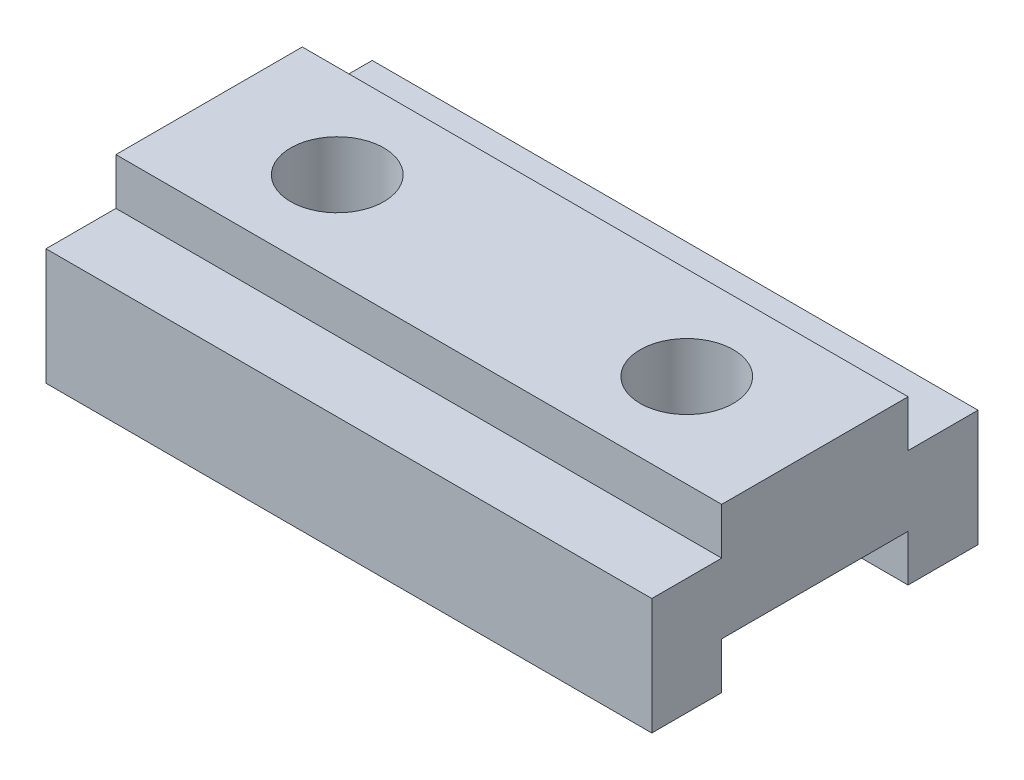
ISO-10303-21;
HEADER;
FILE_DESCRIPTION(('STEP AP214'),'2;1');
FILE_NAME('part.step','',(''),(''),'','','');
FILE_SCHEMA(('AUTOMOTIVE_DESIGN { 1 0 10303 214 1 1 1 1 }'));
ENDSEC;
DATA;
#1=APPLICATION_CONTEXT('core data for automotive mechanical design processes');
#2=APPLICATION_PROTOCOL_DEFINITION('international standard','automotive_design',2000,#1);
#3=PRODUCT_CONTEXT('',#1,'mechanical');
#4=PRODUCT('Part','Part','',(#3));
#5=PRODUCT_RELATED_PRODUCT_CATEGORY('part','',(#4));
#6=PRODUCT_DEFINITION_FORMATION('','',#4);
#7=PRODUCT_DEFINITION_CONTEXT('part definition',#1,'design');
#8=PRODUCT_DEFINITION('design','',#6,#7);
#9=PRODUCT_DEFINITION_SHAPE('','',#8);
#10=(LENGTH_UNIT() NAMED_UNIT(*) SI_UNIT(.MILLI.,.METRE.));
#11=(NAMED_UNIT(*) PLANE_ANGLE_UNIT() SI_UNIT($,.RADIAN.));
#12=(NAMED_UNIT(*) SI_UNIT($,.STERADIAN.) SOLID_ANGLE_UNIT());
#13=UNCERTAINTY_MEASURE_WITH_UNIT(LENGTH_MEASURE(1.E-05),#10,'distance_accuracy_value','');
#14=(GEOMETRIC_REPRESENTATION_CONTEXT(3) GLOBAL_UNCERTAINTY_ASSIGNED_CONTEXT((#13)) GLOBAL_UNIT_ASSIGNED_CONTEXT((#10,
#11,#12)) REPRESENTATION_CONTEXT('',''));
#15=CARTESIAN_POINT('',(0.,0.,0.));
#16=DIRECTION('',(0.,0.,1.));
#17=DIRECTION('',(1.,0.,0.));
#18=AXIS2_PLACEMENT_3D('',#15,#16,#17);
#19=CARTESIAN_POINT('',(-165.1,0.,0.));
#20=DIRECTION('',(0.,0.,1.));
#21=DIRECTION('',(1.,0.,0.));
#22=AXIS2_PLACEMENT_3D('',#19,#20,#21);
#23=PLANE('',#22);
#24=DIRECTION('',(0.,-1.,0.));
#25=VECTOR('',#24,1.);
#26=CARTESIAN_POINT('',(0.,0.,0.));
#27=LINE('',#26,#25);
#28=CARTESIAN_POINT('',(0.,31.75,0.));
#29=VERTEX_POINT('',#28);
#30=CARTESIAN_POINT('',(0.,0.,0.));
#31=VERTEX_POINT('',#30);
#32=EDGE_CURVE('E155',#29,#31,#27,.T.);
#33=ORIENTED_EDGE('',*,*,#32,.F.);
#34=DIRECTION('',(1.,0.,0.));
#35=VECTOR('',#34,1.);
#36=CARTESIAN_POINT('',(-165.1,31.75,0.));
#37=LINE('',#36,#35);
#38=CARTESIAN_POINT('',(-165.1,31.75,0.));
#39=VERTEX_POINT('',#38);
#40=EDGE_CURVE('E11',#39,#29,#37,.T.);
#41=ORIENTED_EDGE('',*,*,#40,.F.);
#42=DIRECTION('',(0.,-1.,0.));
#43=VECTOR('',#42,1.);
#44=CARTESIAN_POINT('',(-165.1,0.,0.));
#45=LINE('',#44,#43);
#46=CARTESIAN_POINT('',(-165.1,0.,0.));
#47=VERTEX_POINT('',#46);
#48=EDGE_CURVE('E187',#39,#47,#45,.T.);
#49=ORIENTED_EDGE('',*,*,#48,.T.);
#50=DIRECTION('',(1.,0.,0.));
#51=VECTOR('',#50,1.);
#52=CARTESIAN_POINT('',(-165.1,0.,0.));
#53=LINE('',#52,#51);
#54=EDGE_CURVE('E101',#47,#31,#53,.T.);
#55=ORIENTED_EDGE('',*,*,#54,.T.);
#56=EDGE_LOOP('',(#33,#41,#49,#55));
#57=FACE_BOUND('',#56,.T.);
#58=ADVANCED_FACE('F33',(#57),#23,.T.);
#59=CARTESIAN_POINT('',(-165.1,31.75,0.));
#60=DIRECTION('',(0.,1.,0.));
#61=DIRECTION('',(0.,0.,1.));
#62=AXIS2_PLACEMENT_3D('',#59,#60,#61);
#63=PLANE('',#62);
#64=DIRECTION('',(0.,0.,1.));
#65=VECTOR('',#64,1.);
#66=CARTESIAN_POINT('',(0.,31.75,0.));
#67=LINE('',#66,#65);
#68=CARTESIAN_POINT('',(0.,31.75,-19.05));
#69=VERTEX_POINT('',#68);
#70=EDGE_CURVE('E185',#69,#29,#67,.T.);
#71=ORIENTED_EDGE('',*,*,#70,.F.);
#72=DIRECTION('',(1.,0.,0.));
#73=VECTOR('',#72,1.);
#74=CARTESIAN_POINT('',(-165.1,31.75,-19.05));
#75=LINE('',#74,#73);
#76=CARTESIAN_POINT('',(-165.1,31.75,-19.05));
#77=VERTEX_POINT('',#76);
#78=EDGE_CURVE('E42',#77,#69,#75,.T.);
#79=ORIENTED_EDGE('',*,*,#78,.F.);
#80=DIRECTION('',(0.,0.,1.));
#81=VECTOR('',#80,1.);
#82=CARTESIAN_POINT('',(-165.1,31.75,0.));
#83=LINE('',#82,#81);
#84=EDGE_CURVE('E145',#77,#39,#83,.T.);
#85=ORIENTED_EDGE('',*,*,#84,.T.);
#86=ORIENTED_EDGE('',*,*,#40,.T.);
#87=EDGE_LOOP('',(#71,#79,#85,#86));
#88=FACE_BOUND('',#87,.T.);
#89=ADVANCED_FACE('F265',(#88),#63,.T.);
#90=CARTESIAN_POINT('',(-165.1,31.75,-19.05));
#91=DIRECTION('',(0.,0.,1.));
#92=DIRECTION('',(1.,0.,0.));
#93=AXIS2_PLACEMENT_3D('',#90,#91,#92);
#94=PLANE('',#93);
#95=DIRECTION('',(0.,-1.,0.));
#96=VECTOR('',#95,1.);
#97=CARTESIAN_POINT('',(0.,31.75,-19.05));
#98=LINE('',#97,#96);
#99=CARTESIAN_POINT('',(0.,44.45,-19.05));
#100=VERTEX_POINT('',#99);
#101=EDGE_CURVE('E132',#100,#69,#98,.T.);
#102=ORIENTED_EDGE('',*,*,#101,.F.);
#103=DIRECTION('',(1.,0.,0.));
#104=VECTOR('',#103,1.);
#105=CARTESIAN_POINT('',(-165.1,44.45,-19.05));
#106=LINE('',#105,#104);
#107=CARTESIAN_POINT('',(-165.1,44.45,-19.05));
#108=VERTEX_POINT('',#107);
#109=EDGE_CURVE('E127',#108,#100,#106,.T.);
#110=ORIENTED_EDGE('',*,*,#109,.F.);
#111=DIRECTION('',(0.,-1.,0.));
#112=VECTOR('',#111,1.);
#113=CARTESIAN_POINT('',(-165.1,31.75,-19.05));
#114=LINE('',#113,#112);
#115=EDGE_CURVE('E130',#108,#77,#114,.T.);
#116=ORIENTED_EDGE('',*,*,#115,.T.);
#117=ORIENTED_EDGE('',*,*,#78,.T.);
#118=EDGE_LOOP('',(#102,#110,#116,#117));
#119=FACE_BOUND('',#118,.T.);
#120=ADVANCED_FACE('F129',(#119),#94,.T.);
#121=CARTESIAN_POINT('',(-165.1,44.45,-19.05));
#122=DIRECTION('',(0.,1.,0.));
#123=DIRECTION('',(0.,0.,1.));
#124=AXIS2_PLACEMENT_3D('',#121,#122,#123);
#125=PLANE('',#124);
#126=CARTESIAN_POINT('',(-130.175,44.45,-44.45));
#127=DIRECTION('',(0.,1.,0.));
#128=DIRECTION('',(0.,0.,1.));
#129=AXIS2_PLACEMENT_3D('',#126,#127,#128);
#130=CIRCLE('',#129,12.7);
#131=CARTESIAN_POINT('',(-130.175,44.45,-31.75));
#132=VERTEX_POINT('',#131);
#133=EDGE_CURVE('E207',#132,#132,#130,.T.);
#134=ORIENTED_EDGE('',*,*,#133,.F.);
#135=EDGE_LOOP('',(#134));
#136=FACE_BOUND('',#135,.T.);
#137=CARTESIAN_POINT('',(-34.925,44.45,-44.45));
#138=DIRECTION('',(0.,1.,0.));
#139=DIRECTION('',(0.,0.,1.));
#140=AXIS2_PLACEMENT_3D('',#137,#138,#139);
#141=CIRCLE('',#140,12.7);
#142=CARTESIAN_POINT('',(-34.925,44.45,-31.75));
#143=VERTEX_POINT('',#142);
#144=EDGE_CURVE('E212',#143,#143,#141,.T.);
#145=ORIENTED_EDGE('',*,*,#144,.F.);
#146=EDGE_LOOP('',(#145));
#147=FACE_BOUND('',#146,.T.);
#148=DIRECTION('',(0.,0.,1.));
#149=VECTOR('',#148,1.);
#150=CARTESIAN_POINT('',(0.,44.45,-19.05));
#151=LINE('',#150,#149);
#152=CARTESIAN_POINT('',(0.,44.45,-69.85));
#153=VERTEX_POINT('',#152);
#154=EDGE_CURVE('E182',#153,#100,#151,.T.);
#155=ORIENTED_EDGE('',*,*,#154,.F.);
#156=DIRECTION('',(1.,0.,0.));
#157=VECTOR('',#156,1.);
#158=CARTESIAN_POINT('',(-165.1,44.45,-69.85));
#159=LINE('',#158,#157);
#160=CARTESIAN_POINT('',(-165.1,44.45,-69.85));
#161=VERTEX_POINT('',#160);
#162=EDGE_CURVE('E137',#161,#153,#159,.T.);
#163=ORIENTED_EDGE('',*,*,#162,.F.);
#164=DIRECTION('',(0.,0.,1.));
#165=VECTOR('',#164,1.);
#166=CARTESIAN_POINT('',(-165.1,44.45,-19.05));
#167=LINE('',#166,#165);
#168=EDGE_CURVE('E143',#161,#108,#167,.T.);
#169=ORIENTED_EDGE('',*,*,#168,.T.);
#170=ORIENTED_EDGE('',*,*,#109,.T.);
#171=EDGE_LOOP('',(#155,#163,#169,#170));
#172=FACE_BOUND('',#171,.T.);
#173=ADVANCED_FACE('F147',(#136,#147,#172),#125,.T.);
#174=CARTESIAN_POINT('',(-165.1,44.45,-69.85));
#175=DIRECTION('',(0.,0.,-1.));
#176=DIRECTION('',(-1.,0.,0.));
#177=AXIS2_PLACEMENT_3D('',#174,#175,#176);
#178=PLANE('',#177);
#179=DIRECTION('',(0.,1.,0.));
#180=VECTOR('',#179,1.);
#181=CARTESIAN_POINT('',(0.,44.45,-69.85));
#182=LINE('',#181,#180);
#183=CARTESIAN_POINT('',(0.,31.75,-69.85));
#184=VERTEX_POINT('',#183);
#185=EDGE_CURVE('E179',#184,#153,#182,.T.);
#186=ORIENTED_EDGE('',*,*,#185,.F.);
#187=DIRECTION('',(1.,0.,0.));
#188=VECTOR('',#187,1.);
#189=CARTESIAN_POINT('',(-165.1,31.75,-69.85));
#190=LINE('',#189,#188);
#191=CARTESIAN_POINT('',(-165.1,31.75,-69.85));
#192=VERTEX_POINT('',#191);
#193=EDGE_CURVE('E191',#192,#184,#190,.T.);
#194=ORIENTED_EDGE('',*,*,#193,.F.);
#195=DIRECTION('',(0.,1.,0.));
#196=VECTOR('',#195,1.);
#197=CARTESIAN_POINT('',(-165.1,44.45,-69.85));
#198=LINE('',#197,#196);
#199=EDGE_CURVE('E148',#192,#161,#198,.T.);
#200=ORIENTED_EDGE('',*,*,#199,.T.);
#201=ORIENTED_EDGE('',*,*,#162,.T.);
#202=EDGE_LOOP('',(#186,#194,#200,#201));
#203=FACE_BOUND('',#202,.T.);
#204=ADVANCED_FACE('F278',(#203),#178,.T.);
#205=CARTESIAN_POINT('',(-165.1,31.75,-69.85));
#206=DIRECTION('',(0.,1.,0.));
#207=DIRECTION('',(0.,0.,1.));
#208=AXIS2_PLACEMENT_3D('',#205,#206,#207);
#209=PLANE('',#208);
#210=DIRECTION('',(0.,0.,1.));
#211=VECTOR('',#210,1.);
#212=CARTESIAN_POINT('',(0.,31.75,-69.85));
#213=LINE('',#212,#211);
#214=CARTESIAN_POINT('',(0.,31.75,-88.9));
#215=VERTEX_POINT('',#214);
#216=EDGE_CURVE('E176',#215,#184,#213,.T.);
#217=ORIENTED_EDGE('',*,*,#216,.F.);
#218=DIRECTION('',(1.,0.,0.));
#219=VECTOR('',#218,1.);
#220=CARTESIAN_POINT('',(-165.1,31.75,-88.9));
#221=LINE('',#220,#219);
#222=CARTESIAN_POINT('',(-165.1,31.75,-88.9));
#223=VERTEX_POINT('',#222);
#224=EDGE_CURVE('E193',#223,#215,#221,.T.);
#225=ORIENTED_EDGE('',*,*,#224,.F.);
#226=DIRECTION('',(0.,0.,1.));
#227=VECTOR('',#226,1.);
#228=CARTESIAN_POINT('',(-165.1,31.75,-69.85));
#229=LINE('',#228,#227);
#230=EDGE_CURVE('E150',#223,#192,#229,.T.);
#231=ORIENTED_EDGE('',*,*,#230,.T.);
#232=ORIENTED_EDGE('',*,*,#193,.T.);
#233=EDGE_LOOP('',(#217,#225,#231,#232));
#234=FACE_BOUND('',#233,.T.);
#235=ADVANCED_FACE('F240',(#234),#209,.T.);
#236=CARTESIAN_POINT('',(-165.1,0.,-88.9));
#237=DIRECTION('',(0.,0.,-1.));
#238=DIRECTION('',(-1.,0.,0.));
#239=AXIS2_PLACEMENT_3D('',#236,#237,#238);
#240=PLANE('',#239);
#241=DIRECTION('',(0.,1.,0.));
#242=VECTOR('',#241,1.);
#243=CARTESIAN_POINT('',(0.,0.,-88.9));
#244=LINE('',#243,#242);
#245=CARTESIAN_POINT('',(0.,0.,-88.9));
#246=VERTEX_POINT('',#245);
#247=EDGE_CURVE('E173',#246,#215,#244,.T.);
#248=ORIENTED_EDGE('',*,*,#247,.F.);
#249=DIRECTION('',(1.,0.,0.));
#250=VECTOR('',#249,1.);
#251=CARTESIAN_POINT('',(-165.1,0.,-88.9));
#252=LINE('',#251,#250);
#253=CARTESIAN_POINT('',(-165.1,0.,-88.9));
#254=VERTEX_POINT('',#253);
#255=EDGE_CURVE('E195',#254,#246,#252,.T.);
#256=ORIENTED_EDGE('',*,*,#255,.F.);
#257=DIRECTION('',(0.,1.,0.));
#258=VECTOR('',#257,1.);
#259=CARTESIAN_POINT('',(-165.1,0.,-88.9));
#260=LINE('',#259,#258);
#261=EDGE_CURVE('E234',#254,#223,#260,.T.);
#262=ORIENTED_EDGE('',*,*,#261,.T.);
#263=ORIENTED_EDGE('',*,*,#224,.T.);
#264=EDGE_LOOP('',(#248,#256,#262,#263));
#265=FACE_BOUND('',#264,.T.);
#266=ADVANCED_FACE('F246',(#265),#240,.T.);
#267=CARTESIAN_POINT('',(-165.1,0.,-69.85));
#268=DIRECTION('',(0.,-1.,0.));
#269=DIRECTION('',(0.,0.,-1.));
#270=AXIS2_PLACEMENT_3D('',#267,#268,#269);
#271=PLANE('',#270);
#272=DIRECTION('',(0.,0.,-1.));
#273=VECTOR('',#272,1.);
#274=CARTESIAN_POINT('',(0.,0.,-69.85));
#275=LINE('',#274,#273);
#276=CARTESIAN_POINT('',(0.,0.,-69.85));
#277=VERTEX_POINT('',#276);
#278=EDGE_CURVE('E170',#277,#246,#275,.T.);
#279=ORIENTED_EDGE('',*,*,#278,.F.);
#280=DIRECTION('',(1.,0.,0.));
#281=VECTOR('',#280,1.);
#282=CARTESIAN_POINT('',(-165.1,0.,-69.85));
#283=LINE('',#282,#281);
#284=CARTESIAN_POINT('',(-165.1,0.,-69.85));
#285=VERTEX_POINT('',#284);
#286=EDGE_CURVE('E197',#285,#277,#283,.T.);
#287=ORIENTED_EDGE('',*,*,#286,.F.);
#288=DIRECTION('',(0.,0.,-1.));
#289=VECTOR('',#288,1.);
#290=CARTESIAN_POINT('',(-165.1,0.,-69.85));
#291=LINE('',#290,#289);
#292=EDGE_CURVE('E231',#285,#254,#291,.T.);
#293=ORIENTED_EDGE('',*,*,#292,.T.);
#294=ORIENTED_EDGE('',*,*,#255,.T.);
#295=EDGE_LOOP('',(#279,#287,#293,#294));
#296=FACE_BOUND('',#295,.T.);
#297=ADVANCED_FACE('F249',(#296),#271,.T.);
#298=CARTESIAN_POINT('',(-165.1,12.7,-69.85));
#299=DIRECTION('',(0.,0.,1.));
#300=DIRECTION('',(1.,0.,0.));
#301=AXIS2_PLACEMENT_3D('',#298,#299,#300);
#302=PLANE('',#301);
#303=DIRECTION('',(0.,-1.,0.));
#304=VECTOR('',#303,1.);
#305=CARTESIAN_POINT('',(0.,12.7,-69.85));
#306=LINE('',#305,#304);
#307=CARTESIAN_POINT('',(0.,12.7,-69.85));
#308=VERTEX_POINT('',#307);
#309=EDGE_CURVE('E167',#308,#277,#306,.T.);
#310=ORIENTED_EDGE('',*,*,#309,.F.);
#311=DIRECTION('',(1.,0.,0.));
#312=VECTOR('',#311,1.);
#313=CARTESIAN_POINT('',(-165.1,12.7,-69.85));
#314=LINE('',#313,#312);
#315=CARTESIAN_POINT('',(-165.1,12.7,-69.85));
#316=VERTEX_POINT('',#315);
#317=EDGE_CURVE('E199',#316,#308,#314,.T.);
#318=ORIENTED_EDGE('',*,*,#317,.F.);
#319=DIRECTION('',(0.,-1.,0.));
#320=VECTOR('',#319,1.);
#321=CARTESIAN_POINT('',(-165.1,12.7,-69.85));
#322=LINE('',#321,#320);
#323=EDGE_CURVE('E228',#316,#285,#322,.T.);
#324=ORIENTED_EDGE('',*,*,#323,.T.);
#325=ORIENTED_EDGE('',*,*,#286,.T.);
#326=EDGE_LOOP('',(#310,#318,#324,#325));
#327=FACE_BOUND('',#326,.T.);
#328=ADVANCED_FACE('F254',(#327),#302,.T.);
#329=CARTESIAN_POINT('',(-165.1,12.7,-19.05));
#330=DIRECTION('',(0.,-1.,0.));
#331=DIRECTION('',(0.,0.,-1.));
#332=AXIS2_PLACEMENT_3D('',#329,#330,#331);
#333=PLANE('',#332);
#334=CARTESIAN_POINT('',(-130.175,12.7,-44.45));
#335=DIRECTION('',(0.,-1.,0.));
#336=DIRECTION('',(0.,0.,-1.));
#337=AXIS2_PLACEMENT_3D('',#334,#335,#336);
#338=CIRCLE('',#337,12.7);
#339=CARTESIAN_POINT('',(-130.175,12.7,-31.75));
#340=VERTEX_POINT('',#339);
#341=EDGE_CURVE('E36',#340,#340,#338,.T.);
#342=ORIENTED_EDGE('',*,*,#341,.F.);
#343=EDGE_LOOP('',(#342));
#344=FACE_BOUND('',#343,.T.);
#345=CARTESIAN_POINT('',(-34.925,12.7,-44.45));
#346=DIRECTION('',(0.,-1.,0.));
#347=DIRECTION('',(0.,0.,-1.));
#348=AXIS2_PLACEMENT_3D('',#345,#346,#347);
#349=CIRCLE('',#348,12.7);
#350=CARTESIAN_POINT('',(-34.925,12.7,-31.75));
#351=VERTEX_POINT('',#350);
#352=EDGE_CURVE('E205',#351,#351,#349,.T.);
#353=ORIENTED_EDGE('',*,*,#352,.F.);
#354=EDGE_LOOP('',(#353));
#355=FACE_BOUND('',#354,.T.);
#356=DIRECTION('',(0.,0.,-1.));
#357=VECTOR('',#356,1.);
#358=CARTESIAN_POINT('',(0.,12.7,-19.05));
#359=LINE('',#358,#357);
#360=CARTESIAN_POINT('',(0.,12.7,-19.05));
#361=VERTEX_POINT('',#360);
#362=EDGE_CURVE('E164',#361,#308,#359,.T.);
#363=ORIENTED_EDGE('',*,*,#362,.F.);
#364=DIRECTION('',(1.,0.,0.));
#365=VECTOR('',#364,1.);
#366=CARTESIAN_POINT('',(-165.1,12.7,-19.05));
#367=LINE('',#366,#365);
#368=CARTESIAN_POINT('',(-165.1,12.7,-19.05));
#369=VERTEX_POINT('',#368);
#370=EDGE_CURVE('E201',#369,#361,#367,.T.);
#371=ORIENTED_EDGE('',*,*,#370,.F.);
#372=DIRECTION('',(0.,0.,-1.));
#373=VECTOR('',#372,1.);
#374=CARTESIAN_POINT('',(-165.1,12.7,-19.05));
#375=LINE('',#374,#373);
#376=EDGE_CURVE('E225',#369,#316,#375,.T.);
#377=ORIENTED_EDGE('',*,*,#376,.T.);
#378=ORIENTED_EDGE('',*,*,#317,.T.);
#379=EDGE_LOOP('',(#363,#371,#377,#378));
#380=FACE_BOUND('',#379,.T.);
#381=ADVANCED_FACE('F257',(#344,#355,#380),#333,.T.);
#382=CARTESIAN_POINT('',(-165.1,0.,-19.05));
#383=DIRECTION('',(0.,0.,-1.));
#384=DIRECTION('',(-1.,0.,0.));
#385=AXIS2_PLACEMENT_3D('',#382,#383,#384);
#386=PLANE('',#385);
#387=DIRECTION('',(0.,1.,0.));
#388=VECTOR('',#387,1.);
#389=CARTESIAN_POINT('',(0.,0.,-19.05));
#390=LINE('',#389,#388);
#391=CARTESIAN_POINT('',(0.,0.,-19.05));
#392=VERTEX_POINT('',#391);
#393=EDGE_CURVE('E161',#392,#361,#390,.T.);
#394=ORIENTED_EDGE('',*,*,#393,.F.);
#395=DIRECTION('',(1.,0.,0.));
#396=VECTOR('',#395,1.);
#397=CARTESIAN_POINT('',(-165.1,0.,-19.05));
#398=LINE('',#397,#396);
#399=CARTESIAN_POINT('',(-165.1,0.,-19.05));
#400=VERTEX_POINT('',#399);
#401=EDGE_CURVE('E203',#400,#392,#398,.T.);
#402=ORIENTED_EDGE('',*,*,#401,.F.);
#403=DIRECTION('',(0.,1.,0.));
#404=VECTOR('',#403,1.);
#405=CARTESIAN_POINT('',(-165.1,0.,-19.05));
#406=LINE('',#405,#404);
#407=EDGE_CURVE('E222',#400,#369,#406,.T.);
#408=ORIENTED_EDGE('',*,*,#407,.T.);
#409=ORIENTED_EDGE('',*,*,#370,.T.);
#410=EDGE_LOOP('',(#394,#402,#408,#409));
#411=FACE_BOUND('',#410,.T.);
#412=ADVANCED_FACE('F261',(#411),#386,.T.);
#413=CARTESIAN_POINT('',(-165.1,0.,0.));
#414=DIRECTION('',(0.,-1.,0.));
#415=DIRECTION('',(0.,0.,-1.));
#416=AXIS2_PLACEMENT_3D('',#413,#414,#415);
#417=PLANE('',#416);
#418=DIRECTION('',(0.,0.,-1.));
#419=VECTOR('',#418,1.);
#420=CARTESIAN_POINT('',(0.,0.,0.));
#421=LINE('',#420,#419);
#422=EDGE_CURVE('E158',#31,#392,#421,.T.);
#423=ORIENTED_EDGE('',*,*,#422,.F.);
#424=ORIENTED_EDGE('',*,*,#54,.F.);
#425=DIRECTION('',(0.,0.,-1.));
#426=VECTOR('',#425,1.);
#427=CARTESIAN_POINT('',(-165.1,0.,0.));
#428=LINE('',#427,#426);
#429=EDGE_CURVE('E220',#47,#400,#428,.T.);
#430=ORIENTED_EDGE('',*,*,#429,.T.);
#431=ORIENTED_EDGE('',*,*,#401,.T.);
#432=EDGE_LOOP('',(#423,#424,#430,#431));
#433=FACE_BOUND('',#432,.T.);
#434=ADVANCED_FACE('F262',(#433),#417,.T.);
#435=CARTESIAN_POINT('',(-165.1,0.,0.));
#436=DIRECTION('',(-1.,0.,0.));
#437=DIRECTION('',(0.,0.,1.));
#438=AXIS2_PLACEMENT_3D('',#435,#436,#437);
#439=PLANE('',#438);
#440=ORIENTED_EDGE('',*,*,#48,.F.);
#441=ORIENTED_EDGE('',*,*,#84,.F.);
#442=ORIENTED_EDGE('',*,*,#115,.F.);
#443=ORIENTED_EDGE('',*,*,#168,.F.);
#444=ORIENTED_EDGE('',*,*,#199,.F.);
#445=ORIENTED_EDGE('',*,*,#230,.F.);
#446=ORIENTED_EDGE('',*,*,#261,.F.);
#447=ORIENTED_EDGE('',*,*,#292,.F.);
#448=ORIENTED_EDGE('',*,*,#323,.F.);
#449=ORIENTED_EDGE('',*,*,#376,.F.);
#450=ORIENTED_EDGE('',*,*,#407,.F.);
#451=ORIENTED_EDGE('',*,*,#429,.F.);
#452=EDGE_LOOP('',(#440,#441,#442,#443,#444,#445,#446,#447,#448,#449,#450,#451));
#453=FACE_BOUND('',#452,.T.);
#454=ADVANCED_FACE('F141',(#453),#439,.T.);
#455=CARTESIAN_POINT('',(0.,0.,0.));
#456=DIRECTION('',(-1.,0.,0.));
#457=DIRECTION('',(0.,0.,1.));
#458=AXIS2_PLACEMENT_3D('',#455,#456,#457);
#459=PLANE('',#458);
#460=ORIENTED_EDGE('',*,*,#32,.T.);
#461=ORIENTED_EDGE('',*,*,#422,.T.);
#462=ORIENTED_EDGE('',*,*,#393,.T.);
#463=ORIENTED_EDGE('',*,*,#362,.T.);
#464=ORIENTED_EDGE('',*,*,#309,.T.);
#465=ORIENTED_EDGE('',*,*,#278,.T.);
#466=ORIENTED_EDGE('',*,*,#247,.T.);
#467=ORIENTED_EDGE('',*,*,#216,.T.);
#468=ORIENTED_EDGE('',*,*,#185,.T.);
#469=ORIENTED_EDGE('',*,*,#154,.T.);
#470=ORIENTED_EDGE('',*,*,#101,.T.);
#471=ORIENTED_EDGE('',*,*,#70,.T.);
#472=EDGE_LOOP('',(#460,#461,#462,#463,#464,#465,#466,#467,#468,#469,#470,#471));
#473=FACE_BOUND('',#472,.T.);
#474=ADVANCED_FACE('F264',(#473),#459,.F.);
#475=CARTESIAN_POINT('',(-34.925,0.,-44.45));
#476=DIRECTION('',(0.,1.,0.));
#477=DIRECTION('',(0.,0.,1.));
#478=AXIS2_PLACEMENT_3D('',#475,#476,#477);
#479=CYLINDRICAL_SURFACE('',#478,12.7);
#480=CARTESIAN_POINT('',(-34.925,12.7,-31.75));
#481=CARTESIAN_POINT('',(-34.925,13.0307291666667,-31.75));
#482=CARTESIAN_POINT('',(-34.925,13.3614583333333,-31.75));
#483=CARTESIAN_POINT('',(-34.925,14.0229166666667,-31.75));
#484=CARTESIAN_POINT('',(-34.925,14.3536458333333,-31.75));
#485=CARTESIAN_POINT('',(-34.925,15.0151041666667,-31.75));
#486=CARTESIAN_POINT('',(-34.925,15.3458333333333,-31.75));
#487=CARTESIAN_POINT('',(-34.925,16.0072916666667,-31.75));
#488=CARTESIAN_POINT('',(-34.925,16.3380208333333,-31.75));
#489=CARTESIAN_POINT('',(-34.925,16.9994791666667,-31.75));
#490=CARTESIAN_POINT('',(-34.925,17.3302083333333,-31.75));
#491=CARTESIAN_POINT('',(-34.925,17.9916666666667,-31.75));
#492=CARTESIAN_POINT('',(-34.925,18.3223958333333,-31.75));
#493=CARTESIAN_POINT('',(-34.925,18.9838541666667,-31.75));
#494=CARTESIAN_POINT('',(-34.925,19.3145833333333,-31.75));
#495=CARTESIAN_POINT('',(-34.925,19.9760416666667,-31.75));
#496=CARTESIAN_POINT('',(-34.925,20.3067708333333,-31.75));
#497=CARTESIAN_POINT('',(-34.925,20.9682291666667,-31.75));
#498=CARTESIAN_POINT('',(-34.925,21.2989583333333,-31.75));
#499=CARTESIAN_POINT('',(-34.925,21.9604166666667,-31.75));
#500=CARTESIAN_POINT('',(-34.925,22.2911458333333,-31.75));
#501=CARTESIAN_POINT('',(-34.925,22.9526041666667,-31.75));
#502=CARTESIAN_POINT('',(-34.925,23.2833333333333,-31.75));
#503=CARTESIAN_POINT('',(-34.925,23.9447916666667,-31.75));
#504=CARTESIAN_POINT('',(-34.925,24.2755208333333,-31.75));
#505=CARTESIAN_POINT('',(-34.925,24.9369791666667,-31.75));
#506=CARTESIAN_POINT('',(-34.925,25.2677083333333,-31.75));
#507=CARTESIAN_POINT('',(-34.925,25.9291666666667,-31.75));
#508=CARTESIAN_POINT('',(-34.925,26.2598958333333,-31.75));
#509=CARTESIAN_POINT('',(-34.925,26.9213541666667,-31.75));
#510=CARTESIAN_POINT('',(-34.925,27.2520833333333,-31.75));
#511=CARTESIAN_POINT('',(-34.925,27.9135416666667,-31.75));
#512=CARTESIAN_POINT('',(-34.925,28.2442708333333,-31.75));
#513=CARTESIAN_POINT('',(-34.925,28.9057291666667,-31.75));
#514=CARTESIAN_POINT('',(-34.925,29.2364583333333,-31.75));
#515=CARTESIAN_POINT('',(-34.925,29.8979166666667,-31.75));
#516=CARTESIAN_POINT('',(-34.925,30.2286458333333,-31.75));
#517=CARTESIAN_POINT('',(-34.925,30.8901041666667,-31.75));
#518=CARTESIAN_POINT('',(-34.925,31.2208333333333,-31.75));
#519=CARTESIAN_POINT('',(-34.925,31.8822916666667,-31.75));
#520=CARTESIAN_POINT('',(-34.925,32.2130208333333,-31.75));
#521=CARTESIAN_POINT('',(-34.925,32.8744791666667,-31.75));
#522=CARTESIAN_POINT('',(-34.925,33.2052083333333,-31.75));
#523=CARTESIAN_POINT('',(-34.925,33.8666666666667,-31.75));
#524=CARTESIAN_POINT('',(-34.925,34.1973958333333,-31.75));
#525=CARTESIAN_POINT('',(-34.925,34.8588541666667,-31.75));
#526=CARTESIAN_POINT('',(-34.925,35.1895833333333,-31.75));
#527=CARTESIAN_POINT('',(-34.925,35.8510416666667,-31.75));
#528=CARTESIAN_POINT('',(-34.925,36.1817708333333,-31.75));
#529=CARTESIAN_POINT('',(-34.925,36.8432291666667,-31.75));
#530=CARTESIAN_POINT('',(-34.925,37.1739583333333,-31.75));
#531=CARTESIAN_POINT('',(-34.925,37.8354166666667,-31.75));
#532=CARTESIAN_POINT('',(-34.925,38.1661458333333,-31.75));
#533=CARTESIAN_POINT('',(-34.925,38.8276041666667,-31.75));
#534=CARTESIAN_POINT('',(-34.925,39.1583333333333,-31.75));
#535=CARTESIAN_POINT('',(-34.925,39.8197916666667,-31.75));
#536=CARTESIAN_POINT('',(-34.925,40.1505208333333,-31.75));
#537=CARTESIAN_POINT('',(-34.925,40.8119791666667,-31.75));
#538=CARTESIAN_POINT('',(-34.925,41.1427083333333,-31.75));
#539=CARTESIAN_POINT('',(-34.925,41.8041666666667,-31.75));
#540=CARTESIAN_POINT('',(-34.925,42.1348958333333,-31.75));
#541=CARTESIAN_POINT('',(-34.925,42.7963541666667,-31.75));
#542=CARTESIAN_POINT('',(-34.925,43.1270833333333,-31.75));
#543=CARTESIAN_POINT('',(-34.925,43.7885416666667,-31.75));
#544=CARTESIAN_POINT('',(-34.925,44.1192708333333,-31.75));
#545=CARTESIAN_POINT('',(-34.925,44.45,-31.75));
#546=B_SPLINE_CURVE_WITH_KNOTS('',3,(#480,#481,#482,#483,#484,#485,#486,#487,#488,#489,#490,
#491,#492,#493,#494,#495,#496,#497,#498,#499,#500,#501,#502,#503,#504,#505,#506,#507,#508,#509,
#510,#511,#512,#513,#514,#515,#516,#517,#518,#519,#520,#521,#522,#523,#524,#525,#526,#527,#528,
#529,#530,#531,#532,#533,#534,#535,#536,#537,#538,#539,#540,#541,#542,#543,#544,#545),
.UNSPECIFIED.,.F.,.F.,(4,2,2,2,2,2,2,2,2,2,2,2,2,2,2,2,2,2,2,2,2,2,2,2,2,2,2,2,2,2,2,2,4),(0.,
0.9921875,1.984375,2.9765625,3.96875,4.9609375,5.953125,6.9453125,7.9375,8.9296875,9.921875,
10.9140625,11.90625,12.8984375,13.890625,14.8828125,15.875,16.8671875,17.859375,18.8515625,
19.84375,20.8359375,21.828125,22.8203125,23.8125,24.8046875,25.796875,26.7890625,27.78125,
28.7734375,29.765625,30.7578125,31.75),.UNSPECIFIED.);
#547=EDGE_CURVE('BSEAM302',#351,#143,#546,.T.);
#548=ORIENTED_EDGE('',*,*,#352,.T.);
#549=ORIENTED_EDGE('',*,*,#144,.T.);
#550=ORIENTED_EDGE('',*,*,#547,.T.);
#551=ORIENTED_EDGE('',*,*,#547,.F.);
#552=EDGE_LOOP('',(#548,#550,#549,#551));
#553=FACE_BOUND('',#552,.T.);
#554=ADVANCED_FACE('F302',(#553),#479,.F.);
#555=CARTESIAN_POINT('',(-130.175,0.,-44.45));
#556=DIRECTION('',(0.,1.,0.));
#557=DIRECTION('',(0.,0.,1.));
#558=AXIS2_PLACEMENT_3D('',#555,#556,#557);
#559=CYLINDRICAL_SURFACE('',#558,12.7);
#560=CARTESIAN_POINT('',(-130.175,12.7,-31.75));
#561=CARTESIAN_POINT('',(-130.175,13.0307291666667,-31.75));
#562=CARTESIAN_POINT('',(-130.175,13.3614583333333,-31.75));
#563=CARTESIAN_POINT('',(-130.175,14.0229166666667,-31.75));
#564=CARTESIAN_POINT('',(-130.175,14.3536458333333,-31.75));
#565=CARTESIAN_POINT('',(-130.175,15.0151041666667,-31.75));
#566=CARTESIAN_POINT('',(-130.175,15.3458333333333,-31.75));
#567=CARTESIAN_POINT('',(-130.175,16.0072916666667,-31.75));
#568=CARTESIAN_POINT('',(-130.175,16.3380208333333,-31.75));
#569=CARTESIAN_POINT('',(-130.175,16.9994791666667,-31.75));
#570=CARTESIAN_POINT('',(-130.175,17.3302083333333,-31.75));
#571=CARTESIAN_POINT('',(-130.175,17.9916666666667,-31.75));
#572=CARTESIAN_POINT('',(-130.175,18.3223958333333,-31.75));
#573=CARTESIAN_POINT('',(-130.175,18.9838541666667,-31.75));
#574=CARTESIAN_POINT('',(-130.175,19.3145833333333,-31.75));
#575=CARTESIAN_POINT('',(-130.175,19.9760416666667,-31.75));
#576=CARTESIAN_POINT('',(-130.175,20.3067708333333,-31.75));
#577=CARTESIAN_POINT('',(-130.175,20.9682291666667,-31.75));
#578=CARTESIAN_POINT('',(-130.175,21.2989583333333,-31.75));
#579=CARTESIAN_POINT('',(-130.175,21.9604166666667,-31.75));
#580=CARTESIAN_POINT('',(-130.175,22.2911458333333,-31.75));
#581=CARTESIAN_POINT('',(-130.175,22.9526041666667,-31.75));
#582=CARTESIAN_POINT('',(-130.175,23.2833333333333,-31.75));
#583=CARTESIAN_POINT('',(-130.175,23.9447916666667,-31.75));
#584=CARTESIAN_POINT('',(-130.175,24.2755208333333,-31.75));
#585=CARTESIAN_POINT('',(-130.175,24.9369791666667,-31.75));
#586=CARTESIAN_POINT('',(-130.175,25.2677083333333,-31.75));
#587=CARTESIAN_POINT('',(-130.175,25.9291666666667,-31.75));
#588=CARTESIAN_POINT('',(-130.175,26.2598958333333,-31.75));
#589=CARTESIAN_POINT('',(-130.175,26.9213541666667,-31.75));
#590=CARTESIAN_POINT('',(-130.175,27.2520833333333,-31.75));
#591=CARTESIAN_POINT('',(-130.175,27.9135416666667,-31.75));
#592=CARTESIAN_POINT('',(-130.175,28.2442708333333,-31.75));
#593=CARTESIAN_POINT('',(-130.175,28.9057291666667,-31.75));
#594=CARTESIAN_POINT('',(-130.175,29.2364583333333,-31.75));
#595=CARTESIAN_POINT('',(-130.175,29.8979166666667,-31.75));
#596=CARTESIAN_POINT('',(-130.175,30.2286458333333,-31.75));
#597=CARTESIAN_POINT('',(-130.175,30.8901041666667,-31.75));
#598=CARTESIAN_POINT('',(-130.175,31.2208333333333,-31.75));
#599=CARTESIAN_POINT('',(-130.175,31.8822916666667,-31.75));
#600=CARTESIAN_POINT('',(-130.175,32.2130208333333,-31.75));
#601=CARTESIAN_POINT('',(-130.175,32.8744791666667,-31.75));
#602=CARTESIAN_POINT('',(-130.175,33.2052083333333,-31.75));
#603=CARTESIAN_POINT('',(-130.175,33.8666666666667,-31.75));
#604=CARTESIAN_POINT('',(-130.175,34.1973958333333,-31.75));
#605=CARTESIAN_POINT('',(-130.175,34.8588541666667,-31.75));
#606=CARTESIAN_POINT('',(-130.175,35.1895833333333,-31.75));
#607=CARTESIAN_POINT('',(-130.175,35.8510416666667,-31.75));
#608=CARTESIAN_POINT('',(-130.175,36.1817708333333,-31.75));
#609=CARTESIAN_POINT('',(-130.175,36.8432291666667,-31.75));
#610=CARTESIAN_POINT('',(-130.175,37.1739583333333,-31.75));
#611=CARTESIAN_POINT('',(-130.175,37.8354166666667,-31.75));
#612=CARTESIAN_POINT('',(-130.175,38.1661458333333,-31.75));
#613=CARTESIAN_POINT('',(-130.175,38.8276041666667,-31.75));
#614=CARTESIAN_POINT('',(-130.175,39.1583333333333,-31.75));
#615=CARTESIAN_POINT('',(-130.175,39.8197916666667,-31.75));
#616=CARTESIAN_POINT('',(-130.175,40.1505208333333,-31.75));
#617=CARTESIAN_POINT('',(-130.175,40.8119791666667,-31.75));
#618=CARTESIAN_POINT('',(-130.175,41.1427083333333,-31.75));
#619=CARTESIAN_POINT('',(-130.175,41.8041666666667,-31.75));
#620=CARTESIAN_POINT('',(-130.175,42.1348958333333,-31.75));
#621=CARTESIAN_POINT('',(-130.175,42.7963541666667,-31.75));
#622=CARTESIAN_POINT('',(-130.175,43.1270833333333,-31.75));
#623=CARTESIAN_POINT('',(-130.175,43.7885416666667,-31.75));
#624=CARTESIAN_POINT('',(-130.175,44.1192708333333,-31.75));
#625=CARTESIAN_POINT('',(-130.175,44.45,-31.75));
#626=B_SPLINE_CURVE_WITH_KNOTS('',3,(#560,#561,#562,#563,#564,#565,#566,#567,#568,#569,#570,
#571,#572,#573,#574,#575,#576,#577,#578,#579,#580,#581,#582,#583,#584,#585,#586,#587,#588,#589,
#590,#591,#592,#593,#594,#595,#596,#597,#598,#599,#600,#601,#602,#603,#604,#605,#606,#607,#608,
#609,#610,#611,#612,#613,#614,#615,#616,#617,#618,#619,#620,#621,#622,#623,#624,#625),
.UNSPECIFIED.,.F.,.F.,(4,2,2,2,2,2,2,2,2,2,2,2,2,2,2,2,2,2,2,2,2,2,2,2,2,2,2,2,2,2,2,2,4),(0.,
0.9921875,1.984375,2.9765625,3.96875,4.9609375,5.953125,6.9453125,7.9375,8.9296875,9.921875,
10.9140625,11.90625,12.8984375,13.890625,14.8828125,15.875,16.8671875,17.859375,18.8515625,
19.84375,20.8359375,21.828125,22.8203125,23.8125,24.8046875,25.796875,26.7890625,27.78125,
28.7734375,29.765625,30.7578125,31.75),.UNSPECIFIED.);
#627=EDGE_CURVE('BSEAM306',#340,#132,#626,.T.);
#628=ORIENTED_EDGE('',*,*,#341,.T.);
#629=ORIENTED_EDGE('',*,*,#133,.T.);
#630=ORIENTED_EDGE('',*,*,#627,.T.);
#631=ORIENTED_EDGE('',*,*,#627,.F.);
#632=EDGE_LOOP('',(#628,#630,#629,#631));
#633=FACE_BOUND('',#632,.T.);
#634=ADVANCED_FACE('F306',(#633),#559,.F.);
#635=CLOSED_SHELL('',(#58,#89,#120,#173,#204,#235,#266,#297,#328,#381,#412,#434,#454,#474,#554,#634));
#636=MANIFOLD_SOLID_BREP('B2',#635);
#637=ADVANCED_BREP_SHAPE_REPRESENTATION('',(#18,#636),#14);
#638=SHAPE_DEFINITION_REPRESENTATION(#9,#637);
ENDSEC;
END-ISO-10303-21;
